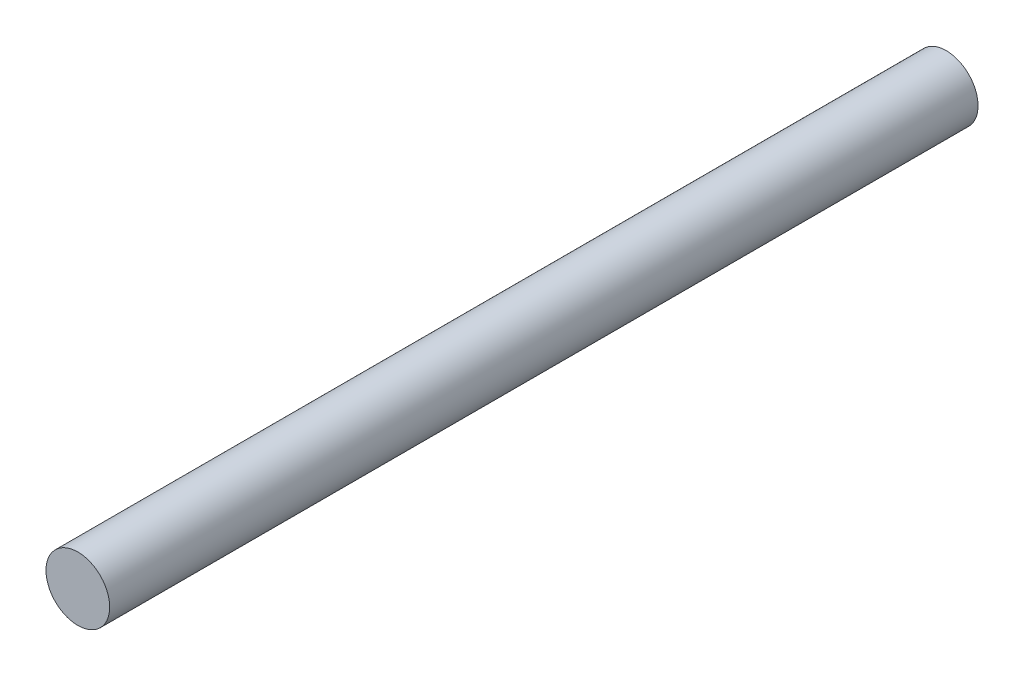
ISO-10303-21;
HEADER;
FILE_DESCRIPTION(('STEP AP214'),'2;1');
FILE_NAME('part.step','',(''),(''),'','','');
FILE_SCHEMA(('AUTOMOTIVE_DESIGN { 1 0 10303 214 1 1 1 1 }'));
ENDSEC;
DATA;
#1=APPLICATION_CONTEXT('core data for automotive mechanical design processes');
#2=APPLICATION_PROTOCOL_DEFINITION('international standard','automotive_design',2000,#1);
#3=PRODUCT_CONTEXT('',#1,'mechanical');
#4=PRODUCT('Part','Part','',(#3));
#5=PRODUCT_RELATED_PRODUCT_CATEGORY('part','',(#4));
#6=PRODUCT_DEFINITION_FORMATION('','',#4);
#7=PRODUCT_DEFINITION_CONTEXT('part definition',#1,'design');
#8=PRODUCT_DEFINITION('design','',#6,#7);
#9=PRODUCT_DEFINITION_SHAPE('','',#8);
#10=(LENGTH_UNIT() NAMED_UNIT(*) SI_UNIT(.MILLI.,.METRE.));
#11=(NAMED_UNIT(*) PLANE_ANGLE_UNIT() SI_UNIT($,.RADIAN.));
#12=(NAMED_UNIT(*) SI_UNIT($,.STERADIAN.) SOLID_ANGLE_UNIT());
#13=UNCERTAINTY_MEASURE_WITH_UNIT(LENGTH_MEASURE(1.E-05),#10,'distance_accuracy_value','');
#14=(GEOMETRIC_REPRESENTATION_CONTEXT(3) GLOBAL_UNCERTAINTY_ASSIGNED_CONTEXT((#13)) GLOBAL_UNIT_ASSIGNED_CONTEXT((#10,
#11,#12)) REPRESENTATION_CONTEXT('',''));
#15=CARTESIAN_POINT('',(0.,0.,0.));
#16=DIRECTION('',(0.,0.,1.));
#17=DIRECTION('',(1.,0.,0.));
#18=AXIS2_PLACEMENT_3D('',#15,#16,#17);
#19=CARTESIAN_POINT('',(0.,0.,90.));
#20=DIRECTION('',(0.,0.,-1.));
#21=DIRECTION('',(-1.,0.,0.));
#22=AXIS2_PLACEMENT_3D('',#19,#20,#21);
#23=CYLINDRICAL_SURFACE('',#22,3.3);
#24=CARTESIAN_POINT('',(0.,0.,90.));
#25=DIRECTION('',(0.,0.,1.));
#26=DIRECTION('',(1.,0.,0.));
#27=AXIS2_PLACEMENT_3D('',#24,#25,#26);
#28=CIRCLE('',#27,3.3);
#29=CARTESIAN_POINT('',(-3.3,0.,90.));
#30=VERTEX_POINT('',#29);
#31=EDGE_CURVE('E10',#30,#30,#28,.T.);
#32=CARTESIAN_POINT('',(0.,0.,0.));
#33=DIRECTION('',(0.,0.,1.));
#34=DIRECTION('',(1.,0.,0.));
#35=AXIS2_PLACEMENT_3D('',#32,#33,#34);
#36=CIRCLE('',#35,3.3);
#37=CARTESIAN_POINT('',(-3.3,0.,0.));
#38=VERTEX_POINT('',#37);
#39=EDGE_CURVE('E33',#38,#38,#36,.T.);
#40=CARTESIAN_POINT('',(-3.3,0.,90.));
#41=CARTESIAN_POINT('',(-3.3,0.,89.0625));
#42=CARTESIAN_POINT('',(-3.3,0.,88.125));
#43=CARTESIAN_POINT('',(-3.3,0.,86.25));
#44=CARTESIAN_POINT('',(-3.3,0.,85.3125));
#45=CARTESIAN_POINT('',(-3.3,0.,83.4375));
#46=CARTESIAN_POINT('',(-3.3,0.,82.5));
#47=CARTESIAN_POINT('',(-3.3,0.,80.625));
#48=CARTESIAN_POINT('',(-3.3,0.,79.6875));
#49=CARTESIAN_POINT('',(-3.3,0.,77.8125));
#50=CARTESIAN_POINT('',(-3.3,0.,76.875));
#51=CARTESIAN_POINT('',(-3.3,0.,75.));
#52=CARTESIAN_POINT('',(-3.3,0.,74.0625));
#53=CARTESIAN_POINT('',(-3.3,0.,72.1875));
#54=CARTESIAN_POINT('',(-3.3,0.,71.25));
#55=CARTESIAN_POINT('',(-3.3,0.,69.375));
#56=CARTESIAN_POINT('',(-3.3,0.,68.4375));
#57=CARTESIAN_POINT('',(-3.3,0.,66.5625));
#58=CARTESIAN_POINT('',(-3.3,0.,65.625));
#59=CARTESIAN_POINT('',(-3.3,0.,63.75));
#60=CARTESIAN_POINT('',(-3.3,0.,62.8125));
#61=CARTESIAN_POINT('',(-3.3,0.,60.9375));
#62=CARTESIAN_POINT('',(-3.3,0.,60.));
#63=CARTESIAN_POINT('',(-3.3,0.,58.125));
#64=CARTESIAN_POINT('',(-3.3,0.,57.1875));
#65=CARTESIAN_POINT('',(-3.3,0.,55.3125));
#66=CARTESIAN_POINT('',(-3.3,0.,54.375));
#67=CARTESIAN_POINT('',(-3.3,0.,52.5));
#68=CARTESIAN_POINT('',(-3.3,0.,51.5625));
#69=CARTESIAN_POINT('',(-3.3,0.,49.6875));
#70=CARTESIAN_POINT('',(-3.3,0.,48.75));
#71=CARTESIAN_POINT('',(-3.3,0.,46.875));
#72=CARTESIAN_POINT('',(-3.3,0.,45.9375));
#73=CARTESIAN_POINT('',(-3.3,0.,44.0625));
#74=CARTESIAN_POINT('',(-3.3,0.,43.125));
#75=CARTESIAN_POINT('',(-3.3,0.,41.25));
#76=CARTESIAN_POINT('',(-3.3,0.,40.3125));
#77=CARTESIAN_POINT('',(-3.3,0.,38.4375));
#78=CARTESIAN_POINT('',(-3.3,0.,37.5));
#79=CARTESIAN_POINT('',(-3.3,0.,35.625));
#80=CARTESIAN_POINT('',(-3.3,0.,34.6875));
#81=CARTESIAN_POINT('',(-3.3,0.,32.8125));
#82=CARTESIAN_POINT('',(-3.3,0.,31.875));
#83=CARTESIAN_POINT('',(-3.3,0.,30.));
#84=CARTESIAN_POINT('',(-3.3,0.,29.0625));
#85=CARTESIAN_POINT('',(-3.3,0.,27.1875));
#86=CARTESIAN_POINT('',(-3.3,0.,26.25));
#87=CARTESIAN_POINT('',(-3.3,0.,24.375));
#88=CARTESIAN_POINT('',(-3.3,0.,23.4375));
#89=CARTESIAN_POINT('',(-3.3,0.,21.5625));
#90=CARTESIAN_POINT('',(-3.3,0.,20.625));
#91=CARTESIAN_POINT('',(-3.3,0.,18.75));
#92=CARTESIAN_POINT('',(-3.3,0.,17.8125));
#93=CARTESIAN_POINT('',(-3.3,0.,15.9375));
#94=CARTESIAN_POINT('',(-3.3,0.,15.));
#95=CARTESIAN_POINT('',(-3.3,0.,13.125));
#96=CARTESIAN_POINT('',(-3.3,0.,12.1875));
#97=CARTESIAN_POINT('',(-3.3,0.,10.3125));
#98=CARTESIAN_POINT('',(-3.3,0.,9.37499999999999));
#99=CARTESIAN_POINT('',(-3.3,0.,7.49999999999999));
#100=CARTESIAN_POINT('',(-3.3,0.,6.56249999999999));
#101=CARTESIAN_POINT('',(-3.3,0.,4.68749999999999));
#102=CARTESIAN_POINT('',(-3.3,0.,3.74999999999998));
#103=CARTESIAN_POINT('',(-3.3,0.,1.87499999999998));
#104=CARTESIAN_POINT('',(-3.3,0.,0.937499999999986));
#105=CARTESIAN_POINT('',(-3.3,0.,0.));
#106=B_SPLINE_CURVE_WITH_KNOTS('',3,(#40,#41,#42,#43,#44,#45,#46,#47,#48,#49,#50,#51,#52,#53,
#54,#55,#56,#57,#58,#59,#60,#61,#62,#63,#64,#65,#66,#67,#68,#69,#70,#71,#72,#73,#74,#75,#76,#77,
#78,#79,#80,#81,#82,#83,#84,#85,#86,#87,#88,#89,#90,#91,#92,#93,#94,#95,#96,#97,#98,#99,#100,
#101,#102,#103,#104,#105),.UNSPECIFIED.,.F.,.F.,(4,2,2,2,2,2,2,2,2,2,2,2,2,2,2,2,2,2,2,2,2,2,2,
2,2,2,2,2,2,2,2,2,4),(0.,2.81250000000001,5.62500000000001,8.43750000000001,11.25,14.0625,
16.875,19.6875,22.5,25.3125,28.125,30.9375,33.75,36.5625,39.375,42.1875,45.,47.8125,50.625,
53.4375,56.25,59.0625,61.875,64.6875,67.5,70.3125,73.125,75.9375,78.75,81.5625,84.375,87.1875,
90.),.UNSPECIFIED.);
#107=EDGE_CURVE('BSEAM30',#30,#38,#106,.T.);
#108=ORIENTED_EDGE('',*,*,#31,.F.);
#109=ORIENTED_EDGE('',*,*,#39,.T.);
#110=ORIENTED_EDGE('',*,*,#107,.T.);
#111=ORIENTED_EDGE('',*,*,#107,.F.);
#112=EDGE_LOOP('',(#108,#110,#109,#111));
#113=FACE_BOUND('',#112,.T.);
#114=ADVANCED_FACE('F30',(#113),#23,.T.);
#115=CARTESIAN_POINT('',(0.,0.,90.));
#116=DIRECTION('',(0.,0.,1.));
#117=DIRECTION('',(1.,0.,0.));
#118=AXIS2_PLACEMENT_3D('',#115,#116,#117);
#119=PLANE('',#118);
#120=ORIENTED_EDGE('',*,*,#31,.T.);
#121=EDGE_LOOP('',(#120));
#122=FACE_BOUND('',#121,.T.);
#123=ADVANCED_FACE('F45',(#122),#119,.T.);
#124=CARTESIAN_POINT('',(0.,0.,0.));
#125=DIRECTION('',(0.,0.,1.));
#126=DIRECTION('',(1.,0.,0.));
#127=AXIS2_PLACEMENT_3D('',#124,#125,#126);
#128=PLANE('',#127);
#129=ORIENTED_EDGE('',*,*,#39,.F.);
#130=EDGE_LOOP('',(#129));
#131=FACE_BOUND('',#130,.T.);
#132=ADVANCED_FACE('F43',(#131),#128,.F.);
#133=CLOSED_SHELL('',(#114,#123,#132));
#134=MANIFOLD_SOLID_BREP('B2',#133);
#135=ADVANCED_BREP_SHAPE_REPRESENTATION('',(#18,#134),#14);
#136=SHAPE_DEFINITION_REPRESENTATION(#9,#135);
ENDSEC;
END-ISO-10303-21;
